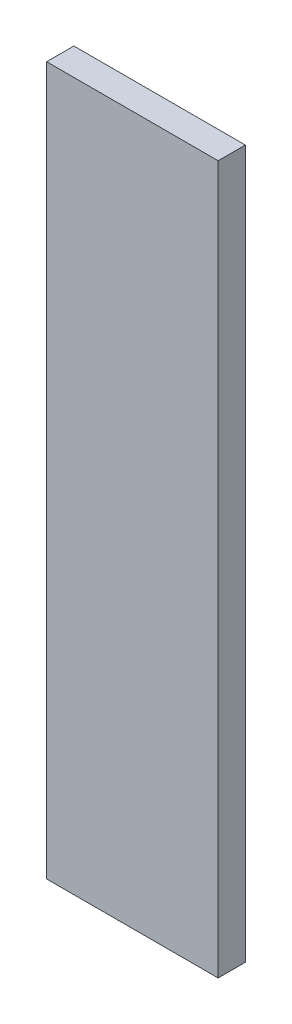
ISO-10303-21;
HEADER;
FILE_DESCRIPTION(('STEP AP214'),'2;1');
FILE_NAME('part.step','',(''),(''),'','','');
FILE_SCHEMA(('AUTOMOTIVE_DESIGN { 1 0 10303 214 1 1 1 1 }'));
ENDSEC;
DATA;
#1=APPLICATION_CONTEXT('core data for automotive mechanical design processes');
#2=APPLICATION_PROTOCOL_DEFINITION('international standard','automotive_design',2000,#1);
#3=PRODUCT_CONTEXT('',#1,'mechanical');
#4=PRODUCT('Part','Part','',(#3));
#5=PRODUCT_RELATED_PRODUCT_CATEGORY('part','',(#4));
#6=PRODUCT_DEFINITION_FORMATION('','',#4);
#7=PRODUCT_DEFINITION_CONTEXT('part definition',#1,'design');
#8=PRODUCT_DEFINITION('design','',#6,#7);
#9=PRODUCT_DEFINITION_SHAPE('','',#8);
#10=(LENGTH_UNIT() NAMED_UNIT(*) SI_UNIT(.MILLI.,.METRE.));
#11=(NAMED_UNIT(*) PLANE_ANGLE_UNIT() SI_UNIT($,.RADIAN.));
#12=(NAMED_UNIT(*) SI_UNIT($,.STERADIAN.) SOLID_ANGLE_UNIT());
#13=UNCERTAINTY_MEASURE_WITH_UNIT(LENGTH_MEASURE(1.E-05),#10,'distance_accuracy_value','');
#14=(GEOMETRIC_REPRESENTATION_CONTEXT(3) GLOBAL_UNCERTAINTY_ASSIGNED_CONTEXT((#13)) GLOBAL_UNIT_ASSIGNED_CONTEXT((#10,
#11,#12)) REPRESENTATION_CONTEXT('',''));
#15=CARTESIAN_POINT('',(0.,0.,0.));
#16=DIRECTION('',(0.,0.,1.));
#17=DIRECTION('',(1.,0.,0.));
#18=AXIS2_PLACEMENT_3D('',#15,#16,#17);
#19=CARTESIAN_POINT('',(0.,0.,2.54));
#20=DIRECTION('',(1.,0.,0.));
#21=DIRECTION('',(0.,0.,-1.));
#22=AXIS2_PLACEMENT_3D('',#19,#20,#21);
#23=PLANE('',#22);
#24=DIRECTION('',(0.,-1.,0.));
#25=VECTOR('',#24,1.);
#26=CARTESIAN_POINT('',(0.,0.,0.));
#27=LINE('',#26,#25);
#28=CARTESIAN_POINT('',(0.,66.04,0.));
#29=VERTEX_POINT('',#28);
#30=CARTESIAN_POINT('',(0.,0.,0.));
#31=VERTEX_POINT('',#30);
#32=EDGE_CURVE('E96',#29,#31,#27,.T.);
#33=ORIENTED_EDGE('',*,*,#32,.T.);
#34=DIRECTION('',(0.,0.,-1.));
#35=VECTOR('',#34,1.);
#36=CARTESIAN_POINT('',(0.,0.,2.54));
#37=LINE('',#36,#35);
#38=CARTESIAN_POINT('',(0.,0.,2.54));
#39=VERTEX_POINT('',#38);
#40=EDGE_CURVE('E11',#39,#31,#37,.T.);
#41=ORIENTED_EDGE('',*,*,#40,.F.);
#42=DIRECTION('',(0.,-1.,0.));
#43=VECTOR('',#42,1.);
#44=CARTESIAN_POINT('',(0.,0.,2.54));
#45=LINE('',#44,#43);
#46=CARTESIAN_POINT('',(0.,66.04,2.54));
#47=VERTEX_POINT('',#46);
#48=EDGE_CURVE('E84',#47,#39,#45,.T.);
#49=ORIENTED_EDGE('',*,*,#48,.F.);
#50=DIRECTION('',(0.,0.,-1.));
#51=VECTOR('',#50,1.);
#52=CARTESIAN_POINT('',(0.,66.04,2.54));
#53=LINE('',#52,#51);
#54=EDGE_CURVE('E92',#47,#29,#53,.T.);
#55=ORIENTED_EDGE('',*,*,#54,.T.);
#56=EDGE_LOOP('',(#33,#41,#49,#55));
#57=FACE_BOUND('',#56,.T.);
#58=ADVANCED_FACE('F33',(#57),#23,.F.);
#59=CARTESIAN_POINT('',(0.,0.,2.54));
#60=DIRECTION('',(0.,1.,0.));
#61=DIRECTION('',(0.,0.,1.));
#62=AXIS2_PLACEMENT_3D('',#59,#60,#61);
#63=PLANE('',#62);
#64=DIRECTION('',(1.,0.,0.));
#65=VECTOR('',#64,1.);
#66=CARTESIAN_POINT('',(0.,0.,0.));
#67=LINE('',#66,#65);
#68=CARTESIAN_POINT('',(16.002,0.,0.));
#69=VERTEX_POINT('',#68);
#70=EDGE_CURVE('E88',#31,#69,#67,.T.);
#71=ORIENTED_EDGE('',*,*,#70,.T.);
#72=DIRECTION('',(0.,0.,-1.));
#73=VECTOR('',#72,1.);
#74=CARTESIAN_POINT('',(16.002,0.,2.54));
#75=LINE('',#74,#73);
#76=CARTESIAN_POINT('',(16.002,0.,2.54));
#77=VERTEX_POINT('',#76);
#78=EDGE_CURVE('E41',#77,#69,#75,.T.);
#79=ORIENTED_EDGE('',*,*,#78,.F.);
#80=DIRECTION('',(1.,0.,0.));
#81=VECTOR('',#80,1.);
#82=CARTESIAN_POINT('',(0.,0.,2.54));
#83=LINE('',#82,#81);
#84=EDGE_CURVE('E79',#39,#77,#83,.T.);
#85=ORIENTED_EDGE('',*,*,#84,.F.);
#86=ORIENTED_EDGE('',*,*,#40,.T.);
#87=EDGE_LOOP('',(#71,#79,#85,#86));
#88=FACE_BOUND('',#87,.T.);
#89=ADVANCED_FACE('F87',(#88),#63,.F.);
#90=CARTESIAN_POINT('',(16.002,0.,2.54));
#91=DIRECTION('',(-1.,0.,0.));
#92=DIRECTION('',(0.,0.,1.));
#93=AXIS2_PLACEMENT_3D('',#90,#91,#92);
#94=PLANE('',#93);
#95=DIRECTION('',(0.,1.,0.));
#96=VECTOR('',#95,1.);
#97=CARTESIAN_POINT('',(16.002,0.,0.));
#98=LINE('',#97,#96);
#99=CARTESIAN_POINT('',(16.002,66.04,0.));
#100=VERTEX_POINT('',#99);
#101=EDGE_CURVE('E66',#69,#100,#98,.T.);
#102=ORIENTED_EDGE('',*,*,#101,.T.);
#103=DIRECTION('',(0.,0.,-1.));
#104=VECTOR('',#103,1.);
#105=CARTESIAN_POINT('',(16.002,66.04,2.54));
#106=LINE('',#105,#104);
#107=CARTESIAN_POINT('',(16.002,66.04,2.54));
#108=VERTEX_POINT('',#107);
#109=EDGE_CURVE('E89',#108,#100,#106,.T.);
#110=ORIENTED_EDGE('',*,*,#109,.F.);
#111=DIRECTION('',(0.,1.,0.));
#112=VECTOR('',#111,1.);
#113=CARTESIAN_POINT('',(16.002,0.,2.54));
#114=LINE('',#113,#112);
#115=EDGE_CURVE('E82',#77,#108,#114,.T.);
#116=ORIENTED_EDGE('',*,*,#115,.F.);
#117=ORIENTED_EDGE('',*,*,#78,.T.);
#118=EDGE_LOOP('',(#102,#110,#116,#117));
#119=FACE_BOUND('',#118,.T.);
#120=ADVANCED_FACE('F90',(#119),#94,.F.);
#121=CARTESIAN_POINT('',(0.,66.04,2.54));
#122=DIRECTION('',(0.,-1.,0.));
#123=DIRECTION('',(0.,0.,-1.));
#124=AXIS2_PLACEMENT_3D('',#121,#122,#123);
#125=PLANE('',#124);
#126=DIRECTION('',(-1.,0.,0.));
#127=VECTOR('',#126,1.);
#128=CARTESIAN_POINT('',(0.,66.04,0.));
#129=LINE('',#128,#127);
#130=EDGE_CURVE('E72',#100,#29,#129,.T.);
#131=ORIENTED_EDGE('',*,*,#130,.T.);
#132=ORIENTED_EDGE('',*,*,#54,.F.);
#133=DIRECTION('',(-1.,0.,0.));
#134=VECTOR('',#133,1.);
#135=CARTESIAN_POINT('',(0.,66.04,2.54));
#136=LINE('',#135,#134);
#137=EDGE_CURVE('E49',#108,#47,#136,.T.);
#138=ORIENTED_EDGE('',*,*,#137,.F.);
#139=ORIENTED_EDGE('',*,*,#109,.T.);
#140=EDGE_LOOP('',(#131,#132,#138,#139));
#141=FACE_BOUND('',#140,.T.);
#142=ADVANCED_FACE('F103',(#141),#125,.F.);
#143=CARTESIAN_POINT('',(0.,0.,2.54));
#144=DIRECTION('',(0.,0.,-1.));
#145=DIRECTION('',(-1.,0.,0.));
#146=AXIS2_PLACEMENT_3D('',#143,#144,#145);
#147=PLANE('',#146);
#148=ORIENTED_EDGE('',*,*,#48,.T.);
#149=ORIENTED_EDGE('',*,*,#84,.T.);
#150=ORIENTED_EDGE('',*,*,#115,.T.);
#151=ORIENTED_EDGE('',*,*,#137,.T.);
#152=EDGE_LOOP('',(#148,#149,#150,#151));
#153=FACE_BOUND('',#152,.T.);
#154=ADVANCED_FACE('F80',(#153),#147,.F.);
#155=CARTESIAN_POINT('',(0.,0.,0.));
#156=DIRECTION('',(0.,0.,-1.));
#157=DIRECTION('',(-1.,0.,0.));
#158=AXIS2_PLACEMENT_3D('',#155,#156,#157);
#159=PLANE('',#158);
#160=ORIENTED_EDGE('',*,*,#32,.F.);
#161=ORIENTED_EDGE('',*,*,#130,.F.);
#162=ORIENTED_EDGE('',*,*,#101,.F.);
#163=ORIENTED_EDGE('',*,*,#70,.F.);
#164=EDGE_LOOP('',(#160,#161,#162,#163));
#165=FACE_BOUND('',#164,.T.);
#166=ADVANCED_FACE('F106',(#165),#159,.T.);
#167=CLOSED_SHELL('',(#58,#89,#120,#142,#154,#166));
#168=MANIFOLD_SOLID_BREP('B2',#167);
#169=ADVANCED_BREP_SHAPE_REPRESENTATION('',(#18,#168),#14);
#170=SHAPE_DEFINITION_REPRESENTATION(#9,#169);
ENDSEC;
END-ISO-10303-21;
